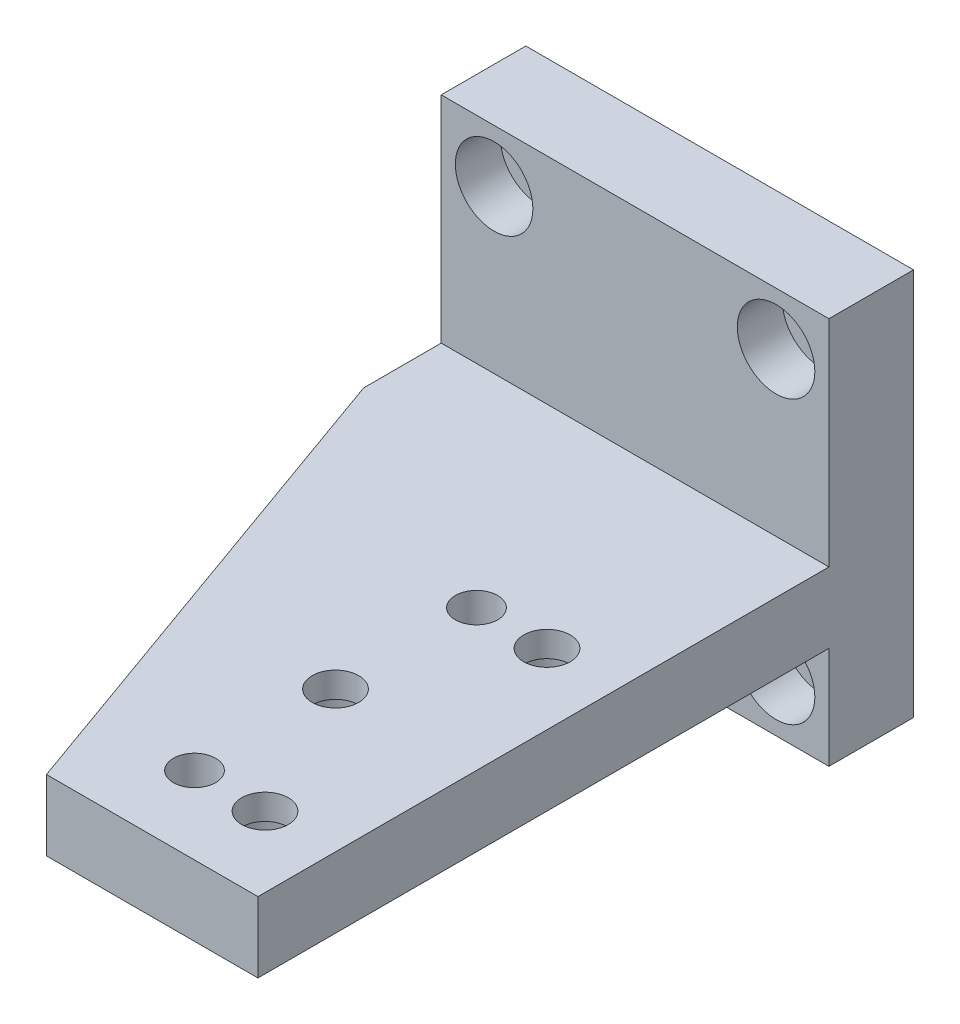
ISO-10303-21;
HEADER;
FILE_DESCRIPTION(('STEP AP214'),'2;1');
FILE_NAME('part.step','',(''),(''),'','','');
FILE_SCHEMA(('AUTOMOTIVE_DESIGN { 1 0 10303 214 1 1 1 1 }'));
ENDSEC;
DATA;
#1=APPLICATION_CONTEXT('core data for automotive mechanical design processes');
#2=APPLICATION_PROTOCOL_DEFINITION('international standard','automotive_design',2000,#1);
#3=PRODUCT_CONTEXT('',#1,'mechanical');
#4=PRODUCT('Part','Part','',(#3));
#5=PRODUCT_RELATED_PRODUCT_CATEGORY('part','',(#4));
#6=PRODUCT_DEFINITION_FORMATION('','',#4);
#7=PRODUCT_DEFINITION_CONTEXT('part definition',#1,'design');
#8=PRODUCT_DEFINITION('design','',#6,#7);
#9=PRODUCT_DEFINITION_SHAPE('','',#8);
#10=(LENGTH_UNIT() NAMED_UNIT(*) SI_UNIT(.MILLI.,.METRE.));
#11=(NAMED_UNIT(*) PLANE_ANGLE_UNIT() SI_UNIT($,.RADIAN.));
#12=(NAMED_UNIT(*) SI_UNIT($,.STERADIAN.) SOLID_ANGLE_UNIT());
#13=UNCERTAINTY_MEASURE_WITH_UNIT(LENGTH_MEASURE(1.E-05),#10,'distance_accuracy_value','');
#14=(GEOMETRIC_REPRESENTATION_CONTEXT(3) GLOBAL_UNCERTAINTY_ASSIGNED_CONTEXT((#13)) GLOBAL_UNIT_ASSIGNED_CONTEXT((#10,
#11,#12)) REPRESENTATION_CONTEXT('',''));
#15=CARTESIAN_POINT('',(0.,0.,0.));
#16=DIRECTION('',(0.,0.,1.));
#17=DIRECTION('',(1.,0.,0.));
#18=AXIS2_PLACEMENT_3D('',#15,#16,#17);
#19=CARTESIAN_POINT('',(0.,0.,6.));
#20=DIRECTION('',(0.,0.,-1.));
#21=DIRECTION('',(-1.,0.,0.));
#22=AXIS2_PLACEMENT_3D('',#19,#20,#21);
#23=PLANE('',#22);
#24=CARTESIAN_POINT('',(20.,20.,6.));
#25=DIRECTION('',(0.,0.,1.));
#26=DIRECTION('',(1.,0.,0.));
#27=AXIS2_PLACEMENT_3D('',#24,#25,#26);
#28=CIRCLE('',#27,5.5);
#29=CARTESIAN_POINT('',(25.5,20.,6.));
#30=VERTEX_POINT('',#29);
#31=EDGE_CURVE('E180',#30,#30,#28,.T.);
#32=ORIENTED_EDGE('',*,*,#31,.F.);
#33=EDGE_LOOP('',(#32));
#34=FACE_BOUND('',#33,.T.);
#35=CARTESIAN_POINT('',(-20.,20.,6.));
#36=DIRECTION('',(0.,0.,1.));
#37=DIRECTION('',(1.,0.,0.));
#38=AXIS2_PLACEMENT_3D('',#35,#36,#37);
#39=CIRCLE('',#38,5.5);
#40=CARTESIAN_POINT('',(-14.5,20.,6.));
#41=VERTEX_POINT('',#40);
#42=EDGE_CURVE('E164',#41,#41,#39,.T.);
#43=ORIENTED_EDGE('',*,*,#42,.F.);
#44=EDGE_LOOP('',(#43));
#45=FACE_BOUND('',#44,.T.);
#46=DIRECTION('',(-1.,0.,0.));
#47=VECTOR('',#46,1.);
#48=CARTESIAN_POINT('',(-27.5,-3.,6.));
#49=LINE('',#48,#47);
#50=CARTESIAN_POINT('',(27.5,-3.,6.));
#51=VERTEX_POINT('',#50);
#52=CARTESIAN_POINT('',(-27.5,-3.,6.));
#53=VERTEX_POINT('',#52);
#54=EDGE_CURVE('E126',#51,#53,#49,.T.);
#55=ORIENTED_EDGE('',*,*,#54,.F.);
#56=DIRECTION('',(0.,-1.,0.));
#57=VECTOR('',#56,1.);
#58=CARTESIAN_POINT('',(27.5,27.5,6.));
#59=LINE('',#58,#57);
#60=CARTESIAN_POINT('',(27.5,27.5,6.));
#61=VERTEX_POINT('',#60);
#62=EDGE_CURVE('E235',#61,#51,#59,.T.);
#63=ORIENTED_EDGE('',*,*,#62,.F.);
#64=DIRECTION('',(1.,0.,0.));
#65=VECTOR('',#64,1.);
#66=CARTESIAN_POINT('',(-27.5,27.5,6.));
#67=LINE('',#66,#65);
#68=CARTESIAN_POINT('',(-27.5,27.5,6.));
#69=VERTEX_POINT('',#68);
#70=EDGE_CURVE('E229',#69,#61,#67,.T.);
#71=ORIENTED_EDGE('',*,*,#70,.F.);
#72=DIRECTION('',(0.,-1.,0.));
#73=VECTOR('',#72,1.);
#74=CARTESIAN_POINT('',(-27.5,27.5,6.));
#75=LINE('',#74,#73);
#76=EDGE_CURVE('E243',#69,#53,#75,.T.);
#77=ORIENTED_EDGE('',*,*,#76,.T.);
#78=EDGE_LOOP('',(#55,#63,#71,#77));
#79=FACE_BOUND('',#78,.T.);
#80=ADVANCED_FACE('F44',(#34,#45,#79),#23,.F.);
#81=CARTESIAN_POINT('',(-20.,-20.,6.));
#82=DIRECTION('',(0.,0.,1.));
#83=DIRECTION('',(1.,0.,0.));
#84=AXIS2_PLACEMENT_3D('',#81,#82,#83);
#85=CIRCLE('',#84,5.5);
#86=CARTESIAN_POINT('',(-14.5,-20.,6.));
#87=VERTEX_POINT('',#86);
#88=EDGE_CURVE('E212',#87,#87,#85,.T.);
#89=ORIENTED_EDGE('',*,*,#88,.F.);
#90=EDGE_LOOP('',(#89));
#91=FACE_BOUND('',#90,.T.);
#92=CARTESIAN_POINT('',(20.,-20.,6.));
#93=DIRECTION('',(0.,0.,1.));
#94=DIRECTION('',(1.,0.,0.));
#95=AXIS2_PLACEMENT_3D('',#92,#93,#94);
#96=CIRCLE('',#95,5.5);
#97=CARTESIAN_POINT('',(25.5,-20.,6.));
#98=VERTEX_POINT('',#97);
#99=EDGE_CURVE('E196',#98,#98,#96,.T.);
#100=ORIENTED_EDGE('',*,*,#99,.F.);
#101=EDGE_LOOP('',(#100));
#102=FACE_BOUND('',#101,.T.);
#103=DIRECTION('',(1.,0.,0.));
#104=VECTOR('',#103,1.);
#105=CARTESIAN_POINT('',(-27.5,-13.,6.));
#106=LINE('',#105,#104);
#107=CARTESIAN_POINT('',(-27.5,-13.,6.));
#108=VERTEX_POINT('',#107);
#109=CARTESIAN_POINT('',(27.5,-13.,6.));
#110=VERTEX_POINT('',#109);
#111=EDGE_CURVE('E133',#108,#110,#106,.T.);
#112=ORIENTED_EDGE('',*,*,#111,.F.);
#113=CARTESIAN_POINT('',(-27.5,-27.5,6.));
#114=VERTEX_POINT('',#113);
#115=EDGE_CURVE('E242',#108,#114,#75,.T.);
#116=ORIENTED_EDGE('',*,*,#115,.T.);
#117=DIRECTION('',(1.,0.,0.));
#118=VECTOR('',#117,1.);
#119=CARTESIAN_POINT('',(-27.5,-27.5,6.));
#120=LINE('',#119,#118);
#121=CARTESIAN_POINT('',(27.5,-27.5,6.));
#122=VERTEX_POINT('',#121);
#123=EDGE_CURVE('E238',#114,#122,#120,.T.);
#124=ORIENTED_EDGE('',*,*,#123,.T.);
#125=EDGE_CURVE('E233',#110,#122,#59,.T.);
#126=ORIENTED_EDGE('',*,*,#125,.F.);
#127=EDGE_LOOP('',(#112,#116,#124,#126));
#128=FACE_BOUND('',#127,.T.);
#129=ADVANCED_FACE('F375',(#91,#102,#128),#23,.F.);
#130=CARTESIAN_POINT('',(-27.5,27.5,6.));
#131=DIRECTION('',(0.,1.,0.));
#132=DIRECTION('',(0.,0.,1.));
#133=AXIS2_PLACEMENT_3D('',#130,#131,#132);
#134=PLANE('',#133);
#135=DIRECTION('',(1.,0.,0.));
#136=VECTOR('',#135,1.);
#137=CARTESIAN_POINT('',(-27.5,27.5,-6.));
#138=LINE('',#137,#136);
#139=CARTESIAN_POINT('',(-27.5,27.5,-6.));
#140=VERTEX_POINT('',#139);
#141=CARTESIAN_POINT('',(27.5,27.5,-6.));
#142=VERTEX_POINT('',#141);
#143=EDGE_CURVE('E228',#140,#142,#138,.T.);
#144=ORIENTED_EDGE('',*,*,#143,.F.);
#145=DIRECTION('',(0.,0.,-1.));
#146=VECTOR('',#145,1.);
#147=CARTESIAN_POINT('',(-27.5,27.5,6.));
#148=LINE('',#147,#146);
#149=EDGE_CURVE('E261',#69,#140,#148,.T.);
#150=ORIENTED_EDGE('',*,*,#149,.F.);
#151=ORIENTED_EDGE('',*,*,#70,.T.);
#152=DIRECTION('',(0.,0.,-1.));
#153=VECTOR('',#152,1.);
#154=CARTESIAN_POINT('',(27.5,27.5,6.));
#155=LINE('',#154,#153);
#156=EDGE_CURVE('E247',#61,#142,#155,.T.);
#157=ORIENTED_EDGE('',*,*,#156,.T.);
#158=EDGE_LOOP('',(#144,#150,#151,#157));
#159=FACE_BOUND('',#158,.T.);
#160=ADVANCED_FACE('F381',(#159),#134,.T.);
#161=CARTESIAN_POINT('',(-27.5,27.5,6.));
#162=DIRECTION('',(1.,0.,0.));
#163=DIRECTION('',(0.,1.,0.));
#164=AXIS2_PLACEMENT_3D('',#161,#162,#163);
#165=PLANE('',#164);
#166=DIRECTION('',(0.,0.,-1.));
#167=VECTOR('',#166,1.);
#168=CARTESIAN_POINT('',(-27.5,-13.,87.));
#169=LINE('',#168,#167);
#170=CARTESIAN_POINT('',(-27.5,-13.,16.9999999999993));
#171=VERTEX_POINT('',#170);
#172=EDGE_CURVE('E136',#171,#108,#169,.T.);
#173=ORIENTED_EDGE('',*,*,#172,.F.);
#174=DIRECTION('',(0.,1.,0.));
#175=VECTOR('',#174,1.);
#176=CARTESIAN_POINT('',(-27.5,-3.,16.9999999999993));
#177=LINE('',#176,#175);
#178=CARTESIAN_POINT('',(-27.5,-3.,16.9999999999993));
#179=VERTEX_POINT('',#178);
#180=EDGE_CURVE('E55',#171,#179,#177,.T.);
#181=ORIENTED_EDGE('',*,*,#180,.T.);
#182=DIRECTION('',(0.,0.,-1.));
#183=VECTOR('',#182,1.);
#184=CARTESIAN_POINT('',(-27.5,-3.,87.));
#185=LINE('',#184,#183);
#186=EDGE_CURVE('E148',#179,#53,#185,.T.);
#187=ORIENTED_EDGE('',*,*,#186,.T.);
#188=ORIENTED_EDGE('',*,*,#76,.F.);
#189=ORIENTED_EDGE('',*,*,#149,.T.);
#190=DIRECTION('',(0.,-1.,0.));
#191=VECTOR('',#190,1.);
#192=CARTESIAN_POINT('',(-27.5,27.5,-6.));
#193=LINE('',#192,#191);
#194=CARTESIAN_POINT('',(-27.5,-27.5,-6.));
#195=VERTEX_POINT('',#194);
#196=EDGE_CURVE('E234',#140,#195,#193,.T.);
#197=ORIENTED_EDGE('',*,*,#196,.T.);
#198=DIRECTION('',(0.,0.,-1.));
#199=VECTOR('',#198,1.);
#200=CARTESIAN_POINT('',(-27.5,-27.5,6.));
#201=LINE('',#200,#199);
#202=EDGE_CURVE('E264',#114,#195,#201,.T.);
#203=ORIENTED_EDGE('',*,*,#202,.F.);
#204=ORIENTED_EDGE('',*,*,#115,.F.);
#205=EDGE_LOOP('',(#173,#181,#187,#188,#189,#197,#203,#204));
#206=FACE_BOUND('',#205,.T.);
#207=ADVANCED_FACE('F393',(#206),#165,.F.);
#208=CARTESIAN_POINT('',(-27.5,-27.5,6.));
#209=DIRECTION('',(0.,1.,0.));
#210=DIRECTION('',(0.,0.,1.));
#211=AXIS2_PLACEMENT_3D('',#208,#209,#210);
#212=PLANE('',#211);
#213=DIRECTION('',(1.,0.,0.));
#214=VECTOR('',#213,1.);
#215=CARTESIAN_POINT('',(-27.5,-27.5,-6.));
#216=LINE('',#215,#214);
#217=CARTESIAN_POINT('',(27.5,-27.5,-6.));
#218=VERTEX_POINT('',#217);
#219=EDGE_CURVE('E255',#195,#218,#216,.T.);
#220=ORIENTED_EDGE('',*,*,#219,.T.);
#221=DIRECTION('',(0.,0.,-1.));
#222=VECTOR('',#221,1.);
#223=CARTESIAN_POINT('',(27.5,-27.5,6.));
#224=LINE('',#223,#222);
#225=EDGE_CURVE('E268',#122,#218,#224,.T.);
#226=ORIENTED_EDGE('',*,*,#225,.F.);
#227=ORIENTED_EDGE('',*,*,#123,.F.);
#228=ORIENTED_EDGE('',*,*,#202,.T.);
#229=EDGE_LOOP('',(#220,#226,#227,#228));
#230=FACE_BOUND('',#229,.T.);
#231=ADVANCED_FACE('F396',(#230),#212,.F.);
#232=CARTESIAN_POINT('',(27.5,27.5,6.));
#233=DIRECTION('',(1.,0.,0.));
#234=DIRECTION('',(0.,1.,0.));
#235=AXIS2_PLACEMENT_3D('',#232,#233,#234);
#236=PLANE('',#235);
#237=DIRECTION('',(0.,-1.,0.));
#238=VECTOR('',#237,1.);
#239=CARTESIAN_POINT('',(27.5,27.5,-6.));
#240=LINE('',#239,#238);
#241=EDGE_CURVE('E251',#142,#218,#240,.T.);
#242=ORIENTED_EDGE('',*,*,#241,.F.);
#243=ORIENTED_EDGE('',*,*,#156,.F.);
#244=ORIENTED_EDGE('',*,*,#62,.T.);
#245=DIRECTION('',(0.,0.,-1.));
#246=VECTOR('',#245,1.);
#247=CARTESIAN_POINT('',(27.5,-3.,87.));
#248=LINE('',#247,#246);
#249=CARTESIAN_POINT('',(27.5,-3.,87.));
#250=VERTEX_POINT('',#249);
#251=EDGE_CURVE('E137',#250,#51,#248,.T.);
#252=ORIENTED_EDGE('',*,*,#251,.F.);
#253=DIRECTION('',(0.,1.,0.));
#254=VECTOR('',#253,1.);
#255=CARTESIAN_POINT('',(27.5,-3.,87.));
#256=LINE('',#255,#254);
#257=CARTESIAN_POINT('',(27.5,-13.,87.));
#258=VERTEX_POINT('',#257);
#259=EDGE_CURVE('E121',#258,#250,#256,.T.);
#260=ORIENTED_EDGE('',*,*,#259,.F.);
#261=DIRECTION('',(0.,0.,-1.));
#262=VECTOR('',#261,1.);
#263=CARTESIAN_POINT('',(27.5,-13.,87.));
#264=LINE('',#263,#262);
#265=EDGE_CURVE('E130',#258,#110,#264,.T.);
#266=ORIENTED_EDGE('',*,*,#265,.T.);
#267=ORIENTED_EDGE('',*,*,#125,.T.);
#268=ORIENTED_EDGE('',*,*,#225,.T.);
#269=EDGE_LOOP('',(#242,#243,#244,#252,#260,#266,#267,#268));
#270=FACE_BOUND('',#269,.T.);
#271=ADVANCED_FACE('F140',(#270),#236,.T.);
#272=CARTESIAN_POINT('',(0.,0.,-6.));
#273=DIRECTION('',(0.,0.,-1.));
#274=DIRECTION('',(-1.,0.,0.));
#275=AXIS2_PLACEMENT_3D('',#272,#273,#274);
#276=PLANE('',#275);
#277=CARTESIAN_POINT('',(-20.,20.,-6.));
#278=DIRECTION('',(0.,0.,1.));
#279=DIRECTION('',(1.,0.,0.));
#280=AXIS2_PLACEMENT_3D('',#277,#278,#279);
#281=CIRCLE('',#280,3.3);
#282=CARTESIAN_POINT('',(-16.7,20.,-6.));
#283=VERTEX_POINT('',#282);
#284=EDGE_CURVE('E176',#283,#283,#281,.T.);
#285=ORIENTED_EDGE('',*,*,#284,.T.);
#286=EDGE_LOOP('',(#285));
#287=FACE_BOUND('',#286,.T.);
#288=CARTESIAN_POINT('',(20.,20.,-6.));
#289=DIRECTION('',(0.,0.,1.));
#290=DIRECTION('',(1.,0.,0.));
#291=AXIS2_PLACEMENT_3D('',#288,#289,#290);
#292=CIRCLE('',#291,3.3);
#293=CARTESIAN_POINT('',(23.3,20.,-6.));
#294=VERTEX_POINT('',#293);
#295=EDGE_CURVE('E192',#294,#294,#292,.T.);
#296=ORIENTED_EDGE('',*,*,#295,.T.);
#297=EDGE_LOOP('',(#296));
#298=FACE_BOUND('',#297,.T.);
#299=CARTESIAN_POINT('',(20.,-20.,-6.));
#300=DIRECTION('',(0.,0.,1.));
#301=DIRECTION('',(1.,0.,0.));
#302=AXIS2_PLACEMENT_3D('',#299,#300,#301);
#303=CIRCLE('',#302,3.3);
#304=CARTESIAN_POINT('',(23.3,-20.,-6.));
#305=VERTEX_POINT('',#304);
#306=EDGE_CURVE('E208',#305,#305,#303,.T.);
#307=ORIENTED_EDGE('',*,*,#306,.T.);
#308=EDGE_LOOP('',(#307));
#309=FACE_BOUND('',#308,.T.);
#310=CARTESIAN_POINT('',(-20.,-20.,-6.));
#311=DIRECTION('',(0.,0.,1.));
#312=DIRECTION('',(1.,0.,0.));
#313=AXIS2_PLACEMENT_3D('',#310,#311,#312);
#314=CIRCLE('',#313,3.3);
#315=CARTESIAN_POINT('',(-16.7,-20.,-6.));
#316=VERTEX_POINT('',#315);
#317=EDGE_CURVE('E224',#316,#316,#314,.T.);
#318=ORIENTED_EDGE('',*,*,#317,.T.);
#319=EDGE_LOOP('',(#318));
#320=FACE_BOUND('',#319,.T.);
#321=ORIENTED_EDGE('',*,*,#143,.T.);
#322=ORIENTED_EDGE('',*,*,#241,.T.);
#323=ORIENTED_EDGE('',*,*,#219,.F.);
#324=ORIENTED_EDGE('',*,*,#196,.F.);
#325=EDGE_LOOP('',(#321,#322,#323,#324));
#326=FACE_BOUND('',#325,.T.);
#327=ADVANCED_FACE('F389',(#287,#298,#309,#320,#326),#276,.T.);
#328=CARTESIAN_POINT('',(-20.,-20.,6.));
#329=DIRECTION('',(0.,0.,1.));
#330=DIRECTION('',(1.,0.,0.));
#331=AXIS2_PLACEMENT_3D('',#328,#329,#330);
#332=CYLINDRICAL_SURFACE('',#331,3.3);
#333=ORIENTED_EDGE('',*,*,#317,.F.);
#334=EDGE_LOOP('',(#333));
#335=FACE_BOUND('',#334,.T.);
#336=CARTESIAN_POINT('',(-20.,-20.,-0.399999999999999));
#337=DIRECTION('',(0.,0.,1.));
#338=DIRECTION('',(1.,0.,0.));
#339=AXIS2_PLACEMENT_3D('',#336,#337,#338);
#340=CIRCLE('',#339,3.3);
#341=CARTESIAN_POINT('',(-16.7,-20.,-0.399999999999999));
#342=VERTEX_POINT('',#341);
#343=EDGE_CURVE('E220',#342,#342,#340,.T.);
#344=ORIENTED_EDGE('',*,*,#343,.T.);
#345=EDGE_LOOP('',(#344));
#346=FACE_BOUND('',#345,.T.);
#347=ADVANCED_FACE('F387',(#335,#346),#332,.F.);
#348=CARTESIAN_POINT('',(-16.7,-20.,-0.399999999999999));
#349=DIRECTION('',(0.,0.,-1.));
#350=DIRECTION('',(-1.,0.,0.));
#351=AXIS2_PLACEMENT_3D('',#348,#349,#350);
#352=PLANE('',#351);
#353=ORIENTED_EDGE('',*,*,#343,.F.);
#354=EDGE_LOOP('',(#353));
#355=FACE_BOUND('',#354,.T.);
#356=CARTESIAN_POINT('',(-20.,-20.,-0.399999999999999));
#357=DIRECTION('',(0.,0.,1.));
#358=DIRECTION('',(1.,0.,0.));
#359=AXIS2_PLACEMENT_3D('',#356,#357,#358);
#360=CIRCLE('',#359,5.5);
#361=CARTESIAN_POINT('',(-14.5,-20.,-0.399999999999999));
#362=VERTEX_POINT('',#361);
#363=EDGE_CURVE('E216',#362,#362,#360,.T.);
#364=ORIENTED_EDGE('',*,*,#363,.T.);
#365=EDGE_LOOP('',(#364));
#366=FACE_BOUND('',#365,.T.);
#367=ADVANCED_FACE('F534',(#355,#366),#352,.F.);
#368=CARTESIAN_POINT('',(-20.,-20.,6.));
#369=DIRECTION('',(0.,0.,1.));
#370=DIRECTION('',(1.,0.,0.));
#371=AXIS2_PLACEMENT_3D('',#368,#369,#370);
#372=CYLINDRICAL_SURFACE('',#371,5.5);
#373=ORIENTED_EDGE('',*,*,#363,.F.);
#374=EDGE_LOOP('',(#373));
#375=FACE_BOUND('',#374,.T.);
#376=ORIENTED_EDGE('',*,*,#88,.T.);
#377=EDGE_LOOP('',(#376));
#378=FACE_BOUND('',#377,.T.);
#379=ADVANCED_FACE('F541',(#375,#378),#372,.F.);
#380=CARTESIAN_POINT('',(20.,-20.,6.));
#381=DIRECTION('',(0.,0.,1.));
#382=DIRECTION('',(1.,0.,0.));
#383=AXIS2_PLACEMENT_3D('',#380,#381,#382);
#384=CYLINDRICAL_SURFACE('',#383,3.3);
#385=ORIENTED_EDGE('',*,*,#306,.F.);
#386=EDGE_LOOP('',(#385));
#387=FACE_BOUND('',#386,.T.);
#388=CARTESIAN_POINT('',(20.,-20.,-0.399999999999999));
#389=DIRECTION('',(0.,0.,1.));
#390=DIRECTION('',(1.,0.,0.));
#391=AXIS2_PLACEMENT_3D('',#388,#389,#390);
#392=CIRCLE('',#391,3.3);
#393=CARTESIAN_POINT('',(23.3,-20.,-0.399999999999999));
#394=VERTEX_POINT('',#393);
#395=EDGE_CURVE('E204',#394,#394,#392,.T.);
#396=ORIENTED_EDGE('',*,*,#395,.T.);
#397=EDGE_LOOP('',(#396));
#398=FACE_BOUND('',#397,.T.);
#399=ADVANCED_FACE('F548',(#387,#398),#384,.F.);
#400=CARTESIAN_POINT('',(23.3,-20.,-0.399999999999999));
#401=DIRECTION('',(0.,0.,-1.));
#402=DIRECTION('',(-1.,0.,0.));
#403=AXIS2_PLACEMENT_3D('',#400,#401,#402);
#404=PLANE('',#403);
#405=ORIENTED_EDGE('',*,*,#395,.F.);
#406=EDGE_LOOP('',(#405));
#407=FACE_BOUND('',#406,.T.);
#408=CARTESIAN_POINT('',(20.,-20.,-0.399999999999999));
#409=DIRECTION('',(0.,0.,1.));
#410=DIRECTION('',(1.,0.,0.));
#411=AXIS2_PLACEMENT_3D('',#408,#409,#410);
#412=CIRCLE('',#411,5.5);
#413=CARTESIAN_POINT('',(25.5,-20.,-0.399999999999999));
#414=VERTEX_POINT('',#413);
#415=EDGE_CURVE('E200',#414,#414,#412,.T.);
#416=ORIENTED_EDGE('',*,*,#415,.T.);
#417=EDGE_LOOP('',(#416));
#418=FACE_BOUND('',#417,.T.);
#419=ADVANCED_FACE('F556',(#407,#418),#404,.F.);
#420=CARTESIAN_POINT('',(20.,-20.,6.));
#421=DIRECTION('',(0.,0.,1.));
#422=DIRECTION('',(1.,0.,0.));
#423=AXIS2_PLACEMENT_3D('',#420,#421,#422);
#424=CYLINDRICAL_SURFACE('',#423,5.5);
#425=ORIENTED_EDGE('',*,*,#415,.F.);
#426=EDGE_LOOP('',(#425));
#427=FACE_BOUND('',#426,.T.);
#428=ORIENTED_EDGE('',*,*,#99,.T.);
#429=EDGE_LOOP('',(#428));
#430=FACE_BOUND('',#429,.T.);
#431=ADVANCED_FACE('F564',(#427,#430),#424,.F.);
#432=CARTESIAN_POINT('',(20.,20.,6.));
#433=DIRECTION('',(0.,0.,1.));
#434=DIRECTION('',(1.,0.,0.));
#435=AXIS2_PLACEMENT_3D('',#432,#433,#434);
#436=CYLINDRICAL_SURFACE('',#435,3.3);
#437=ORIENTED_EDGE('',*,*,#295,.F.);
#438=EDGE_LOOP('',(#437));
#439=FACE_BOUND('',#438,.T.);
#440=CARTESIAN_POINT('',(20.,20.,-0.399999999999999));
#441=DIRECTION('',(0.,0.,1.));
#442=DIRECTION('',(1.,0.,0.));
#443=AXIS2_PLACEMENT_3D('',#440,#441,#442);
#444=CIRCLE('',#443,3.3);
#445=CARTESIAN_POINT('',(23.3,20.,-0.399999999999999));
#446=VERTEX_POINT('',#445);
#447=EDGE_CURVE('E188',#446,#446,#444,.T.);
#448=ORIENTED_EDGE('',*,*,#447,.T.);
#449=EDGE_LOOP('',(#448));
#450=FACE_BOUND('',#449,.T.);
#451=ADVANCED_FACE('F572',(#439,#450),#436,.F.);
#452=CARTESIAN_POINT('',(23.3,20.,-0.399999999999999));
#453=DIRECTION('',(0.,0.,-1.));
#454=DIRECTION('',(-1.,0.,0.));
#455=AXIS2_PLACEMENT_3D('',#452,#453,#454);
#456=PLANE('',#455);
#457=ORIENTED_EDGE('',*,*,#447,.F.);
#458=EDGE_LOOP('',(#457));
#459=FACE_BOUND('',#458,.T.);
#460=CARTESIAN_POINT('',(20.,20.,-0.399999999999999));
#461=DIRECTION('',(0.,0.,1.));
#462=DIRECTION('',(1.,0.,0.));
#463=AXIS2_PLACEMENT_3D('',#460,#461,#462);
#464=CIRCLE('',#463,5.5);
#465=CARTESIAN_POINT('',(25.5,20.,-0.399999999999999));
#466=VERTEX_POINT('',#465);
#467=EDGE_CURVE('E184',#466,#466,#464,.T.);
#468=ORIENTED_EDGE('',*,*,#467,.T.);
#469=EDGE_LOOP('',(#468));
#470=FACE_BOUND('',#469,.T.);
#471=ADVANCED_FACE('F580',(#459,#470),#456,.F.);
#472=CARTESIAN_POINT('',(20.,20.,6.));
#473=DIRECTION('',(0.,0.,1.));
#474=DIRECTION('',(1.,0.,0.));
#475=AXIS2_PLACEMENT_3D('',#472,#473,#474);
#476=CYLINDRICAL_SURFACE('',#475,5.5);
#477=ORIENTED_EDGE('',*,*,#467,.F.);
#478=EDGE_LOOP('',(#477));
#479=FACE_BOUND('',#478,.T.);
#480=ORIENTED_EDGE('',*,*,#31,.T.);
#481=EDGE_LOOP('',(#480));
#482=FACE_BOUND('',#481,.T.);
#483=ADVANCED_FACE('F588',(#479,#482),#476,.F.);
#484=CARTESIAN_POINT('',(-20.,20.,6.));
#485=DIRECTION('',(0.,0.,1.));
#486=DIRECTION('',(1.,0.,0.));
#487=AXIS2_PLACEMENT_3D('',#484,#485,#486);
#488=CYLINDRICAL_SURFACE('',#487,3.3);
#489=ORIENTED_EDGE('',*,*,#284,.F.);
#490=EDGE_LOOP('',(#489));
#491=FACE_BOUND('',#490,.T.);
#492=CARTESIAN_POINT('',(-20.,20.,-0.399999999999999));
#493=DIRECTION('',(0.,0.,1.));
#494=DIRECTION('',(1.,0.,0.));
#495=AXIS2_PLACEMENT_3D('',#492,#493,#494);
#496=CIRCLE('',#495,3.3);
#497=CARTESIAN_POINT('',(-16.7,20.,-0.399999999999999));
#498=VERTEX_POINT('',#497);
#499=EDGE_CURVE('E172',#498,#498,#496,.T.);
#500=ORIENTED_EDGE('',*,*,#499,.T.);
#501=EDGE_LOOP('',(#500));
#502=FACE_BOUND('',#501,.T.);
#503=ADVANCED_FACE('F596',(#491,#502),#488,.F.);
#504=CARTESIAN_POINT('',(-16.7,20.,-0.399999999999999));
#505=DIRECTION('',(0.,0.,-1.));
#506=DIRECTION('',(-1.,0.,0.));
#507=AXIS2_PLACEMENT_3D('',#504,#505,#506);
#508=PLANE('',#507);
#509=ORIENTED_EDGE('',*,*,#499,.F.);
#510=EDGE_LOOP('',(#509));
#511=FACE_BOUND('',#510,.T.);
#512=CARTESIAN_POINT('',(-20.,20.,-0.399999999999999));
#513=DIRECTION('',(0.,0.,1.));
#514=DIRECTION('',(1.,0.,0.));
#515=AXIS2_PLACEMENT_3D('',#512,#513,#514);
#516=CIRCLE('',#515,5.5);
#517=CARTESIAN_POINT('',(-14.5,20.,-0.399999999999999));
#518=VERTEX_POINT('',#517);
#519=EDGE_CURVE('E168',#518,#518,#516,.T.);
#520=ORIENTED_EDGE('',*,*,#519,.T.);
#521=EDGE_LOOP('',(#520));
#522=FACE_BOUND('',#521,.T.);
#523=ADVANCED_FACE('F369',(#511,#522),#508,.F.);
#524=CARTESIAN_POINT('',(-20.,20.,6.));
#525=DIRECTION('',(0.,0.,1.));
#526=DIRECTION('',(1.,0.,0.));
#527=AXIS2_PLACEMENT_3D('',#524,#525,#526);
#528=CYLINDRICAL_SURFACE('',#527,5.5);
#529=ORIENTED_EDGE('',*,*,#519,.F.);
#530=EDGE_LOOP('',(#529));
#531=FACE_BOUND('',#530,.T.);
#532=ORIENTED_EDGE('',*,*,#42,.T.);
#533=EDGE_LOOP('',(#532));
#534=FACE_BOUND('',#533,.T.);
#535=ADVANCED_FACE('F359',(#531,#534),#528,.F.);
#536=CARTESIAN_POINT('',(-27.5,-13.,87.));
#537=DIRECTION('',(0.,1.,0.));
#538=DIRECTION('',(0.,0.,1.));
#539=AXIS2_PLACEMENT_3D('',#536,#537,#538);
#540=PLANE('',#539);
#541=CARTESIAN_POINT('',(7.49999999999998,-13.,36.));
#542=DIRECTION('',(0.,-1.,0.));
#543=DIRECTION('',(0.,0.,-1.));
#544=AXIS2_PLACEMENT_3D('',#541,#542,#543);
#545=CIRCLE('',#544,2.99999999999999);
#546=CARTESIAN_POINT('',(7.49999999999998,-13.,33.));
#547=VERTEX_POINT('',#546);
#548=EDGE_CURVE('E312',#547,#547,#545,.T.);
#549=ORIENTED_EDGE('',*,*,#548,.F.);
#550=EDGE_LOOP('',(#549));
#551=FACE_BOUND('',#550,.T.);
#552=CARTESIAN_POINT('',(7.49999999999998,-13.,76.));
#553=DIRECTION('',(0.,-1.,0.));
#554=DIRECTION('',(0.,0.,-1.));
#555=AXIS2_PLACEMENT_3D('',#552,#553,#554);
#556=CIRCLE('',#555,2.99999999999999);
#557=CARTESIAN_POINT('',(7.49999999999998,-13.,73.));
#558=VERTEX_POINT('',#557);
#559=EDGE_CURVE('E298',#558,#558,#556,.T.);
#560=ORIENTED_EDGE('',*,*,#559,.F.);
#561=EDGE_LOOP('',(#560));
#562=FACE_BOUND('',#561,.T.);
#563=CARTESIAN_POINT('',(17.5,-13.,76.));
#564=DIRECTION('',(0.,-1.,0.));
#565=DIRECTION('',(0.,0.,-1.));
#566=AXIS2_PLACEMENT_3D('',#563,#564,#565);
#567=CIRCLE('',#566,5.5);
#568=CARTESIAN_POINT('',(17.5,-13.,70.5));
#569=VERTEX_POINT('',#568);
#570=EDGE_CURVE('E297',#569,#569,#567,.T.);
#571=ORIENTED_EDGE('',*,*,#570,.F.);
#572=EDGE_LOOP('',(#571));
#573=FACE_BOUND('',#572,.T.);
#574=CARTESIAN_POINT('',(7.49999999999998,-13.,56.));
#575=DIRECTION('',(0.,-1.,0.));
#576=DIRECTION('',(0.,0.,-1.));
#577=AXIS2_PLACEMENT_3D('',#574,#575,#576);
#578=CIRCLE('',#577,5.5);
#579=CARTESIAN_POINT('',(7.49999999999998,-13.,50.5));
#580=VERTEX_POINT('',#579);
#581=EDGE_CURVE('E287',#580,#580,#578,.T.);
#582=ORIENTED_EDGE('',*,*,#581,.F.);
#583=EDGE_LOOP('',(#582));
#584=FACE_BOUND('',#583,.T.);
#585=CARTESIAN_POINT('',(17.5,-13.,36.));
#586=DIRECTION('',(0.,-1.,0.));
#587=DIRECTION('',(0.,0.,-1.));
#588=AXIS2_PLACEMENT_3D('',#585,#586,#587);
#589=CIRCLE('',#588,5.5);
#590=CARTESIAN_POINT('',(17.5,-13.,30.5));
#591=VERTEX_POINT('',#590);
#592=EDGE_CURVE('E281',#591,#591,#589,.T.);
#593=ORIENTED_EDGE('',*,*,#592,.F.);
#594=EDGE_LOOP('',(#593));
#595=FACE_BOUND('',#594,.T.);
#596=DIRECTION('',(1.,0.,0.));
#597=VECTOR('',#596,1.);
#598=CARTESIAN_POINT('',(-27.5,-13.,87.));
#599=LINE('',#598,#597);
#600=CARTESIAN_POINT('',(-2.49999999999998,-13.,87.));
#601=VERTEX_POINT('',#600);
#602=EDGE_CURVE('E116',#601,#258,#599,.T.);
#603=ORIENTED_EDGE('',*,*,#602,.F.);
#604=DIRECTION('',(-0.336336396998154,0.,-0.941741911594838));
#605=VECTOR('',#604,1.);
#606=CARTESIAN_POINT('',(-2.49999999999998,-13.,87.));
#607=LINE('',#606,#605);
#608=EDGE_CURVE('E70',#601,#171,#607,.T.);
#609=ORIENTED_EDGE('',*,*,#608,.T.);
#610=ORIENTED_EDGE('',*,*,#172,.T.);
#611=ORIENTED_EDGE('',*,*,#111,.T.);
#612=ORIENTED_EDGE('',*,*,#265,.F.);
#613=EDGE_LOOP('',(#603,#609,#610,#611,#612));
#614=FACE_BOUND('',#613,.T.);
#615=ADVANCED_FACE('F131',(#551,#562,#573,#584,#595,#614),#540,.F.);
#616=CARTESIAN_POINT('',(-27.5,-3.,87.));
#617=DIRECTION('',(0.,-1.,0.));
#618=DIRECTION('',(1.,0.,0.));
#619=AXIS2_PLACEMENT_3D('',#616,#617,#618);
#620=PLANE('',#619);
#621=CARTESIAN_POINT('',(7.49999999999998,-3.,36.));
#622=DIRECTION('',(0.,-1.,0.));
#623=DIRECTION('',(1.,0.,0.));
#624=AXIS2_PLACEMENT_3D('',#621,#622,#623);
#625=CIRCLE('',#624,2.99999999999999);
#626=CARTESIAN_POINT('',(10.5,-3.,36.));
#627=VERTEX_POINT('',#626);
#628=EDGE_CURVE('E49',#627,#627,#625,.T.);
#629=ORIENTED_EDGE('',*,*,#628,.T.);
#630=EDGE_LOOP('',(#629));
#631=FACE_BOUND('',#630,.T.);
#632=CARTESIAN_POINT('',(7.49999999999998,-3.,76.));
#633=DIRECTION('',(0.,-1.,0.));
#634=DIRECTION('',(1.,0.,0.));
#635=AXIS2_PLACEMENT_3D('',#632,#633,#634);
#636=CIRCLE('',#635,2.99999999999999);
#637=CARTESIAN_POINT('',(10.5,-3.,76.));
#638=VERTEX_POINT('',#637);
#639=EDGE_CURVE('E294',#638,#638,#636,.T.);
#640=ORIENTED_EDGE('',*,*,#639,.T.);
#641=EDGE_LOOP('',(#640));
#642=FACE_BOUND('',#641,.T.);
#643=CARTESIAN_POINT('',(17.5,-3.,76.));
#644=DIRECTION('',(0.,-1.,0.));
#645=DIRECTION('',(1.,0.,0.));
#646=AXIS2_PLACEMENT_3D('',#643,#644,#645);
#647=CIRCLE('',#646,3.29999999999999);
#648=CARTESIAN_POINT('',(20.8,-3.,76.));
#649=VERTEX_POINT('',#648);
#650=EDGE_CURVE('E283',#649,#649,#647,.T.);
#651=ORIENTED_EDGE('',*,*,#650,.T.);
#652=EDGE_LOOP('',(#651));
#653=FACE_BOUND('',#652,.T.);
#654=CARTESIAN_POINT('',(7.49999999999998,-3.,56.));
#655=DIRECTION('',(0.,-1.,0.));
#656=DIRECTION('',(1.,0.,0.));
#657=AXIS2_PLACEMENT_3D('',#654,#655,#656);
#658=CIRCLE('',#657,3.29999999999999);
#659=CARTESIAN_POINT('',(10.8,-3.,56.));
#660=VERTEX_POINT('',#659);
#661=EDGE_CURVE('E277',#660,#660,#658,.T.);
#662=ORIENTED_EDGE('',*,*,#661,.T.);
#663=EDGE_LOOP('',(#662));
#664=FACE_BOUND('',#663,.T.);
#665=CARTESIAN_POINT('',(17.5,-3.,36.));
#666=DIRECTION('',(0.,-1.,0.));
#667=DIRECTION('',(1.,0.,0.));
#668=AXIS2_PLACEMENT_3D('',#665,#666,#667);
#669=CIRCLE('',#668,3.29999999999999);
#670=CARTESIAN_POINT('',(20.8,-3.,36.));
#671=VERTEX_POINT('',#670);
#672=EDGE_CURVE('E154',#671,#671,#669,.T.);
#673=ORIENTED_EDGE('',*,*,#672,.T.);
#674=EDGE_LOOP('',(#673));
#675=FACE_BOUND('',#674,.T.);
#676=ORIENTED_EDGE('',*,*,#186,.F.);
#677=DIRECTION('',(0.336336396998154,0.,0.941741911594838));
#678=VECTOR('',#677,1.);
#679=CARTESIAN_POINT('',(-2.49999999999998,-3.,87.));
#680=LINE('',#679,#678);
#681=CARTESIAN_POINT('',(-2.49999999999998,-3.,87.));
#682=VERTEX_POINT('',#681);
#683=EDGE_CURVE('E11',#179,#682,#680,.T.);
#684=ORIENTED_EDGE('',*,*,#683,.T.);
#685=DIRECTION('',(-1.,0.,0.));
#686=VECTOR('',#685,1.);
#687=CARTESIAN_POINT('',(-27.5,-3.,87.));
#688=LINE('',#687,#686);
#689=EDGE_CURVE('E145',#250,#682,#688,.T.);
#690=ORIENTED_EDGE('',*,*,#689,.F.);
#691=ORIENTED_EDGE('',*,*,#251,.T.);
#692=ORIENTED_EDGE('',*,*,#54,.T.);
#693=EDGE_LOOP('',(#676,#684,#690,#691,#692));
#694=FACE_BOUND('',#693,.T.);
#695=ADVANCED_FACE('F358',(#631,#642,#653,#664,#675,#694),#620,.F.);
#696=CARTESIAN_POINT('',(0.,0.,87.));
#697=DIRECTION('',(0.,0.,1.));
#698=DIRECTION('',(1.,0.,0.));
#699=AXIS2_PLACEMENT_3D('',#696,#697,#698);
#700=PLANE('',#699);
#701=ORIENTED_EDGE('',*,*,#689,.T.);
#702=DIRECTION('',(0.,-1.,0.));
#703=VECTOR('',#702,1.);
#704=CARTESIAN_POINT('',(-2.49999999999998,-13.,87.));
#705=LINE('',#704,#703);
#706=EDGE_CURVE('E124',#682,#601,#705,.T.);
#707=ORIENTED_EDGE('',*,*,#706,.T.);
#708=ORIENTED_EDGE('',*,*,#602,.T.);
#709=ORIENTED_EDGE('',*,*,#259,.T.);
#710=EDGE_LOOP('',(#701,#707,#708,#709));
#711=FACE_BOUND('',#710,.T.);
#712=ADVANCED_FACE('F119',(#711),#700,.T.);
#713=CARTESIAN_POINT('',(17.5,-13.,36.));
#714=DIRECTION('',(0.,-1.,0.));
#715=DIRECTION('',(0.,0.,-1.));
#716=AXIS2_PLACEMENT_3D('',#713,#714,#715);
#717=CYLINDRICAL_SURFACE('',#716,3.29999999999999);
#718=CARTESIAN_POINT('',(17.5,-6.6,36.));
#719=DIRECTION('',(0.,-1.,0.));
#720=DIRECTION('',(0.,0.,-1.));
#721=AXIS2_PLACEMENT_3D('',#718,#719,#720);
#722=CIRCLE('',#721,3.3);
#723=CARTESIAN_POINT('',(17.5,-6.6,32.7));
#724=VERTEX_POINT('',#723);
#725=EDGE_CURVE('E276',#724,#724,#722,.T.);
#726=ORIENTED_EDGE('',*,*,#725,.T.);
#727=EDGE_LOOP('',(#726));
#728=FACE_BOUND('',#727,.T.);
#729=ORIENTED_EDGE('',*,*,#672,.F.);
#730=EDGE_LOOP('',(#729));
#731=FACE_BOUND('',#730,.T.);
#732=ADVANCED_FACE('F341',(#728,#731),#717,.F.);
#733=CARTESIAN_POINT('',(20.8,-6.6,36.));
#734=DIRECTION('',(0.,1.,0.));
#735=DIRECTION('',(0.,0.,1.));
#736=AXIS2_PLACEMENT_3D('',#733,#734,#735);
#737=PLANE('',#736);
#738=ORIENTED_EDGE('',*,*,#725,.F.);
#739=EDGE_LOOP('',(#738));
#740=FACE_BOUND('',#739,.T.);
#741=CARTESIAN_POINT('',(17.5,-6.6,36.));
#742=DIRECTION('',(0.,-1.,0.));
#743=DIRECTION('',(0.,0.,-1.));
#744=AXIS2_PLACEMENT_3D('',#741,#742,#743);
#745=CIRCLE('',#744,5.5);
#746=CARTESIAN_POINT('',(17.5,-6.6,30.5));
#747=VERTEX_POINT('',#746);
#748=EDGE_CURVE('E334',#747,#747,#745,.T.);
#749=ORIENTED_EDGE('',*,*,#748,.T.);
#750=EDGE_LOOP('',(#749));
#751=FACE_BOUND('',#750,.T.);
#752=ADVANCED_FACE('F344',(#740,#751),#737,.F.);
#753=CARTESIAN_POINT('',(17.5,-13.,36.));
#754=DIRECTION('',(0.,-1.,0.));
#755=DIRECTION('',(0.,0.,-1.));
#756=AXIS2_PLACEMENT_3D('',#753,#754,#755);
#757=CYLINDRICAL_SURFACE('',#756,5.5);
#758=ORIENTED_EDGE('',*,*,#748,.F.);
#759=EDGE_LOOP('',(#758));
#760=FACE_BOUND('',#759,.T.);
#761=ORIENTED_EDGE('',*,*,#592,.T.);
#762=EDGE_LOOP('',(#761));
#763=FACE_BOUND('',#762,.T.);
#764=ADVANCED_FACE('F347',(#760,#763),#757,.F.);
#765=CARTESIAN_POINT('',(7.49999999999998,-13.,56.));
#766=DIRECTION('',(0.,-1.,0.));
#767=DIRECTION('',(0.,0.,-1.));
#768=AXIS2_PLACEMENT_3D('',#765,#766,#767);
#769=CYLINDRICAL_SURFACE('',#768,3.29999999999999);
#770=CARTESIAN_POINT('',(7.49999999999998,-6.6,56.));
#771=DIRECTION('',(0.,-1.,0.));
#772=DIRECTION('',(0.,0.,-1.));
#773=AXIS2_PLACEMENT_3D('',#770,#771,#772);
#774=CIRCLE('',#773,3.3);
#775=CARTESIAN_POINT('',(7.49999999999998,-6.6,52.7));
#776=VERTEX_POINT('',#775);
#777=EDGE_CURVE('E282',#776,#776,#774,.T.);
#778=ORIENTED_EDGE('',*,*,#777,.T.);
#779=EDGE_LOOP('',(#778));
#780=FACE_BOUND('',#779,.T.);
#781=ORIENTED_EDGE('',*,*,#661,.F.);
#782=EDGE_LOOP('',(#781));
#783=FACE_BOUND('',#782,.T.);
#784=ADVANCED_FACE('F353',(#780,#783),#769,.F.);
#785=CARTESIAN_POINT('',(10.8,-6.6,56.));
#786=DIRECTION('',(0.,1.,0.));
#787=DIRECTION('',(0.,0.,1.));
#788=AXIS2_PLACEMENT_3D('',#785,#786,#787);
#789=PLANE('',#788);
#790=ORIENTED_EDGE('',*,*,#777,.F.);
#791=EDGE_LOOP('',(#790));
#792=FACE_BOUND('',#791,.T.);
#793=CARTESIAN_POINT('',(7.49999999999998,-6.6,56.));
#794=DIRECTION('',(0.,-1.,0.));
#795=DIRECTION('',(0.,0.,-1.));
#796=AXIS2_PLACEMENT_3D('',#793,#794,#795);
#797=CIRCLE('',#796,5.5);
#798=CARTESIAN_POINT('',(7.49999999999998,-6.6,50.5));
#799=VERTEX_POINT('',#798);
#800=EDGE_CURVE('E324',#799,#799,#797,.T.);
#801=ORIENTED_EDGE('',*,*,#800,.T.);
#802=EDGE_LOOP('',(#801));
#803=FACE_BOUND('',#802,.T.);
#804=ADVANCED_FACE('F450',(#792,#803),#789,.F.);
#805=CARTESIAN_POINT('',(7.49999999999998,-13.,56.));
#806=DIRECTION('',(0.,-1.,0.));
#807=DIRECTION('',(0.,0.,-1.));
#808=AXIS2_PLACEMENT_3D('',#805,#806,#807);
#809=CYLINDRICAL_SURFACE('',#808,5.5);
#810=ORIENTED_EDGE('',*,*,#800,.F.);
#811=EDGE_LOOP('',(#810));
#812=FACE_BOUND('',#811,.T.);
#813=ORIENTED_EDGE('',*,*,#581,.T.);
#814=EDGE_LOOP('',(#813));
#815=FACE_BOUND('',#814,.T.);
#816=ADVANCED_FACE('F446',(#812,#815),#809,.F.);
#817=CARTESIAN_POINT('',(17.5,-13.,76.));
#818=DIRECTION('',(0.,-1.,0.));
#819=DIRECTION('',(0.,0.,-1.));
#820=AXIS2_PLACEMENT_3D('',#817,#818,#819);
#821=CYLINDRICAL_SURFACE('',#820,3.29999999999999);
#822=CARTESIAN_POINT('',(17.5,-6.6,76.));
#823=DIRECTION('',(0.,-1.,0.));
#824=DIRECTION('',(0.,0.,-1.));
#825=AXIS2_PLACEMENT_3D('',#822,#823,#824);
#826=CIRCLE('',#825,3.3);
#827=CARTESIAN_POINT('',(17.5,-6.6,72.7));
#828=VERTEX_POINT('',#827);
#829=EDGE_CURVE('E288',#828,#828,#826,.T.);
#830=ORIENTED_EDGE('',*,*,#829,.T.);
#831=EDGE_LOOP('',(#830));
#832=FACE_BOUND('',#831,.T.);
#833=ORIENTED_EDGE('',*,*,#650,.F.);
#834=EDGE_LOOP('',(#833));
#835=FACE_BOUND('',#834,.T.);
#836=ADVANCED_FACE('F437',(#832,#835),#821,.F.);
#837=CARTESIAN_POINT('',(20.8,-6.6,76.));
#838=DIRECTION('',(0.,1.,0.));
#839=DIRECTION('',(0.,0.,1.));
#840=AXIS2_PLACEMENT_3D('',#837,#838,#839);
#841=PLANE('',#840);
#842=ORIENTED_EDGE('',*,*,#829,.F.);
#843=EDGE_LOOP('',(#842));
#844=FACE_BOUND('',#843,.T.);
#845=CARTESIAN_POINT('',(17.5,-6.6,76.));
#846=DIRECTION('',(0.,-1.,0.));
#847=DIRECTION('',(0.,0.,-1.));
#848=AXIS2_PLACEMENT_3D('',#845,#846,#847);
#849=CIRCLE('',#848,5.5);
#850=CARTESIAN_POINT('',(17.5,-6.6,70.5));
#851=VERTEX_POINT('',#850);
#852=EDGE_CURVE('E304',#851,#851,#849,.T.);
#853=ORIENTED_EDGE('',*,*,#852,.T.);
#854=EDGE_LOOP('',(#853));
#855=FACE_BOUND('',#854,.T.);
#856=ADVANCED_FACE('F431',(#844,#855),#841,.F.);
#857=CARTESIAN_POINT('',(17.5,-13.,76.));
#858=DIRECTION('',(0.,-1.,0.));
#859=DIRECTION('',(0.,0.,-1.));
#860=AXIS2_PLACEMENT_3D('',#857,#858,#859);
#861=CYLINDRICAL_SURFACE('',#860,5.5);
#862=ORIENTED_EDGE('',*,*,#852,.F.);
#863=EDGE_LOOP('',(#862));
#864=FACE_BOUND('',#863,.T.);
#865=ORIENTED_EDGE('',*,*,#570,.T.);
#866=EDGE_LOOP('',(#865));
#867=FACE_BOUND('',#866,.T.);
#868=ADVANCED_FACE('F425',(#864,#867),#861,.F.);
#869=CARTESIAN_POINT('',(-2.49999999999998,0.,87.));
#870=DIRECTION('',(-0.941741911594838,0.,0.336336396998154));
#871=DIRECTION('',(0.,1.,0.));
#872=AXIS2_PLACEMENT_3D('',#869,#870,#871);
#873=PLANE('',#872);
#874=ORIENTED_EDGE('',*,*,#683,.F.);
#875=ORIENTED_EDGE('',*,*,#180,.F.);
#876=ORIENTED_EDGE('',*,*,#608,.F.);
#877=ORIENTED_EDGE('',*,*,#706,.F.);
#878=EDGE_LOOP('',(#874,#875,#876,#877));
#879=FACE_BOUND('',#878,.T.);
#880=ADVANCED_FACE('F47',(#879),#873,.T.);
#881=CARTESIAN_POINT('',(7.49999999999998,-13.,76.));
#882=DIRECTION('',(0.,-1.,0.));
#883=DIRECTION('',(0.,0.,-1.));
#884=AXIS2_PLACEMENT_3D('',#881,#882,#883);
#885=CYLINDRICAL_SURFACE('',#884,2.99999999999999);
#886=ORIENTED_EDGE('',*,*,#559,.T.);
#887=EDGE_LOOP('',(#886));
#888=FACE_BOUND('',#887,.T.);
#889=ORIENTED_EDGE('',*,*,#639,.F.);
#890=EDGE_LOOP('',(#889));
#891=FACE_BOUND('',#890,.T.);
#892=ADVANCED_FACE('F424',(#888,#891),#885,.F.);
#893=CARTESIAN_POINT('',(7.49999999999998,-13.,36.));
#894=DIRECTION('',(0.,-1.,0.));
#895=DIRECTION('',(0.,0.,-1.));
#896=AXIS2_PLACEMENT_3D('',#893,#894,#895);
#897=CYLINDRICAL_SURFACE('',#896,2.99999999999999);
#898=ORIENTED_EDGE('',*,*,#548,.T.);
#899=EDGE_LOOP('',(#898));
#900=FACE_BOUND('',#899,.T.);
#901=ORIENTED_EDGE('',*,*,#628,.F.);
#902=EDGE_LOOP('',(#901));
#903=FACE_BOUND('',#902,.T.);
#904=ADVANCED_FACE('F429',(#900,#903),#897,.F.);
#905=CLOSED_SHELL('',(#80,#129,#160,#207,#231,#271,#327,#347,#367,#379,#399,#419,#431,#451,#471,
#483,#503,#523,#535,#615,#695,#712,#732,#752,#764,#784,#804,#816,#836,#856,#868,#880,#892,#904));
#906=MANIFOLD_SOLID_BREP('B2',#905);
#907=ADVANCED_BREP_SHAPE_REPRESENTATION('',(#18,#906),#14);
#908=SHAPE_DEFINITION_REPRESENTATION(#9,#907);
ENDSEC;
END-ISO-10303-21;
